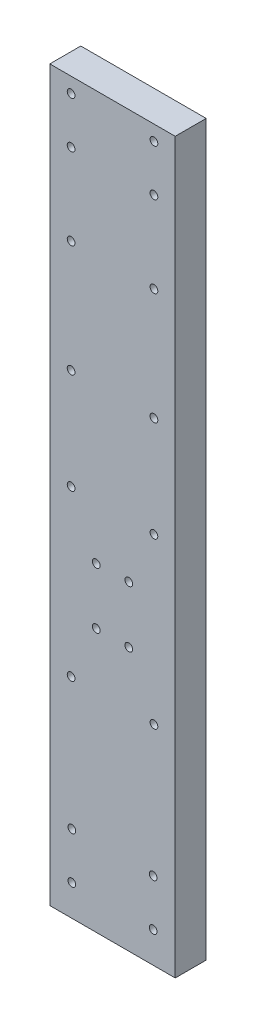
ISO-10303-21;
HEADER;
FILE_DESCRIPTION(('STEP AP214'),'2;1');
FILE_NAME('part.step','',(''),(''),'','','');
FILE_SCHEMA(('AUTOMOTIVE_DESIGN { 1 0 10303 214 1 1 1 1 }'));
ENDSEC;
DATA;
#1=APPLICATION_CONTEXT('core data for automotive mechanical design processes');
#2=APPLICATION_PROTOCOL_DEFINITION('international standard','automotive_design',2000,#1);
#3=PRODUCT_CONTEXT('',#1,'mechanical');
#4=PRODUCT('Part','Part','',(#3));
#5=PRODUCT_RELATED_PRODUCT_CATEGORY('part','',(#4));
#6=PRODUCT_DEFINITION_FORMATION('','',#4);
#7=PRODUCT_DEFINITION_CONTEXT('part definition',#1,'design');
#8=PRODUCT_DEFINITION('design','',#6,#7);
#9=PRODUCT_DEFINITION_SHAPE('','',#8);
#10=(LENGTH_UNIT() NAMED_UNIT(*) SI_UNIT(.MILLI.,.METRE.));
#11=(NAMED_UNIT(*) PLANE_ANGLE_UNIT() SI_UNIT($,.RADIAN.));
#12=(NAMED_UNIT(*) SI_UNIT($,.STERADIAN.) SOLID_ANGLE_UNIT());
#13=UNCERTAINTY_MEASURE_WITH_UNIT(LENGTH_MEASURE(1.E-05),#10,'distance_accuracy_value','');
#14=(GEOMETRIC_REPRESENTATION_CONTEXT(3) GLOBAL_UNCERTAINTY_ASSIGNED_CONTEXT((#13)) GLOBAL_UNIT_ASSIGNED_CONTEXT((#10,
#11,#12)) REPRESENTATION_CONTEXT('',''));
#15=CARTESIAN_POINT('',(0.,0.,0.));
#16=DIRECTION('',(0.,0.,1.));
#17=DIRECTION('',(1.,0.,0.));
#18=AXIS2_PLACEMENT_3D('',#15,#16,#17);
#19=CARTESIAN_POINT('',(0.,0.,4.));
#20=DIRECTION('',(0.,0.,-1.));
#21=DIRECTION('',(-1.,0.,0.));
#22=AXIS2_PLACEMENT_3D('',#19,#20,#21);
#23=PLANE('',#22);
#24=CARTESIAN_POINT('',(2.7500000000009,92.0614488310554,4.));
#25=DIRECTION('',(0.,0.,1.));
#26=DIRECTION('',(-1.,0.,0.));
#27=AXIS2_PLACEMENT_3D('',#24,#25,#26);
#28=CIRCLE('',#27,0.499999999999999);
#29=CARTESIAN_POINT('',(2.2500000000009,92.0614488310554,4.));
#30=VERTEX_POINT('',#29);
#31=EDGE_CURVE('E218',#30,#30,#28,.T.);
#32=ORIENTED_EDGE('',*,*,#31,.F.);
#33=EDGE_LOOP('',(#32));
#34=FACE_BOUND('',#33,.T.);
#35=CARTESIAN_POINT('',(13.4500000000022,86.0614488310554,4.));
#36=DIRECTION('',(0.,0.,1.));
#37=DIRECTION('',(1.,0.,0.));
#38=AXIS2_PLACEMENT_3D('',#35,#36,#37);
#39=CIRCLE('',#38,0.499999999999999);
#40=CARTESIAN_POINT('',(13.9500000000022,86.0614488310554,4.));
#41=VERTEX_POINT('',#40);
#42=EDGE_CURVE('E206',#41,#41,#39,.T.);
#43=ORIENTED_EDGE('',*,*,#42,.F.);
#44=EDGE_LOOP('',(#43));
#45=FACE_BOUND('',#44,.T.);
#46=CARTESIAN_POINT('',(13.4500000000001,75.5614488310554,4.));
#47=DIRECTION('',(0.,0.,1.));
#48=DIRECTION('',(1.,0.,0.));
#49=AXIS2_PLACEMENT_3D('',#46,#47,#48);
#50=CIRCLE('',#49,0.499999999999996);
#51=CARTESIAN_POINT('',(13.9500000000001,75.5614488310554,4.));
#52=VERTEX_POINT('',#51);
#53=EDGE_CURVE('E194',#52,#52,#50,.T.);
#54=ORIENTED_EDGE('',*,*,#53,.F.);
#55=EDGE_LOOP('',(#54));
#56=FACE_BOUND('',#55,.T.);
#57=CARTESIAN_POINT('',(13.350000000001,3.84644883105539,4.));
#58=DIRECTION('',(0.,0.,1.));
#59=DIRECTION('',(-1.,0.,0.));
#60=AXIS2_PLACEMENT_3D('',#57,#58,#59);
#61=CIRCLE('',#60,0.499999999999995);
#62=CARTESIAN_POINT('',(12.850000000001,3.84644883105539,4.));
#63=VERTEX_POINT('',#62);
#64=EDGE_CURVE('E182',#63,#63,#61,.T.);
#65=ORIENTED_EDGE('',*,*,#64,.F.);
#66=EDGE_LOOP('',(#65));
#67=FACE_BOUND('',#66,.T.);
#68=CARTESIAN_POINT('',(2.84999999999999,3.84644883105539,4.));
#69=DIRECTION('',(0.,0.,1.));
#70=DIRECTION('',(1.,0.,0.));
#71=AXIS2_PLACEMENT_3D('',#68,#69,#70);
#72=CIRCLE('',#71,0.499999999999999);
#73=CARTESIAN_POINT('',(3.34999999999999,3.84644883105539,4.));
#74=VERTEX_POINT('',#73);
#75=EDGE_CURVE('E170',#74,#74,#72,.T.);
#76=ORIENTED_EDGE('',*,*,#75,.F.);
#77=EDGE_LOOP('',(#76));
#78=FACE_BOUND('',#77,.T.);
#79=CARTESIAN_POINT('',(2.85,9.84644883105539,4.));
#80=DIRECTION('',(0.,0.,1.));
#81=DIRECTION('',(1.,0.,0.));
#82=AXIS2_PLACEMENT_3D('',#79,#80,#81);
#83=CIRCLE('',#82,0.499999999999999);
#84=CARTESIAN_POINT('',(3.35,9.84644883105539,4.));
#85=VERTEX_POINT('',#84);
#86=EDGE_CURVE('E158',#85,#85,#83,.T.);
#87=ORIENTED_EDGE('',*,*,#86,.F.);
#88=EDGE_LOOP('',(#87));
#89=FACE_BOUND('',#88,.T.);
#90=CARTESIAN_POINT('',(13.4500000000001,48.1064488310554,4.));
#91=DIRECTION('',(0.,0.,1.));
#92=DIRECTION('',(1.,0.,0.));
#93=AXIS2_PLACEMENT_3D('',#90,#91,#92);
#94=CIRCLE('',#93,0.499999999999999);
#95=CARTESIAN_POINT('',(13.9500000000001,48.1064488310554,4.));
#96=VERTEX_POINT('',#95);
#97=EDGE_CURVE('E146',#96,#96,#94,.T.);
#98=ORIENTED_EDGE('',*,*,#97,.F.);
#99=EDGE_LOOP('',(#98));
#100=FACE_BOUND('',#99,.T.);
#101=CARTESIAN_POINT('',(13.4500000000001,26.8464488310553,4.));
#102=DIRECTION('',(0.,0.,1.));
#103=DIRECTION('',(1.,0.,0.));
#104=AXIS2_PLACEMENT_3D('',#101,#102,#103);
#105=CIRCLE('',#104,0.499999999999999);
#106=CARTESIAN_POINT('',(13.9500000000001,26.8464488310553,4.));
#107=VERTEX_POINT('',#106);
#108=EDGE_CURVE('E134',#107,#107,#105,.T.);
#109=ORIENTED_EDGE('',*,*,#108,.F.);
#110=EDGE_LOOP('',(#109));
#111=FACE_BOUND('',#110,.T.);
#112=CARTESIAN_POINT('',(10.2000000000001,33.846448831055,4.));
#113=DIRECTION('',(0.,0.,1.));
#114=DIRECTION('',(1.,0.,0.));
#115=AXIS2_PLACEMENT_3D('',#112,#113,#114);
#116=CIRCLE('',#115,0.499999999999999);
#117=CARTESIAN_POINT('',(10.7000000000001,33.846448831055,4.));
#118=VERTEX_POINT('',#117);
#119=EDGE_CURVE('E122',#118,#118,#116,.T.);
#120=ORIENTED_EDGE('',*,*,#119,.F.);
#121=EDGE_LOOP('',(#120));
#122=FACE_BOUND('',#121,.T.);
#123=CARTESIAN_POINT('',(10.2000000000001,41.1664488310547,4.));
#124=DIRECTION('',(0.,0.,1.));
#125=DIRECTION('',(1.,0.,0.));
#126=AXIS2_PLACEMENT_3D('',#123,#124,#125);
#127=CIRCLE('',#126,0.499999999999999);
#128=CARTESIAN_POINT('',(10.7000000000001,41.1664488310547,4.));
#129=VERTEX_POINT('',#128);
#130=EDGE_CURVE('E101',#129,#129,#127,.T.);
#131=ORIENTED_EDGE('',*,*,#130,.F.);
#132=EDGE_LOOP('',(#131));
#133=FACE_BOUND('',#132,.T.);
#134=DIRECTION('',(1.,0.,0.));
#135=VECTOR('',#134,1.);
#136=CARTESIAN_POINT('',(0.,-0.15355116894461,4.));
#137=LINE('',#136,#135);
#138=CARTESIAN_POINT('',(0.,-0.15355116894461,4.));
#139=VERTEX_POINT('',#138);
#140=CARTESIAN_POINT('',(16.2,-0.15355116894461,4.));
#141=VERTEX_POINT('',#140);
#142=EDGE_CURVE('E86',#139,#141,#137,.T.);
#143=ORIENTED_EDGE('',*,*,#142,.T.);
#144=DIRECTION('',(0.,1.,0.));
#145=VECTOR('',#144,1.);
#146=CARTESIAN_POINT('',(16.2,94.0064488310554,4.));
#147=LINE('',#146,#145);
#148=CARTESIAN_POINT('',(16.2,94.0064488310554,4.));
#149=VERTEX_POINT('',#148);
#150=EDGE_CURVE('E81',#141,#149,#147,.T.);
#151=ORIENTED_EDGE('',*,*,#150,.T.);
#152=DIRECTION('',(-1.,0.,0.));
#153=VECTOR('',#152,1.);
#154=CARTESIAN_POINT('',(0.,94.0064488310554,4.));
#155=LINE('',#154,#153);
#156=CARTESIAN_POINT('',(0.,94.0064488310554,4.));
#157=VERTEX_POINT('',#156);
#158=EDGE_CURVE('E84',#149,#157,#155,.T.);
#159=ORIENTED_EDGE('',*,*,#158,.T.);
#160=DIRECTION('',(0.,-1.,0.));
#161=VECTOR('',#160,1.);
#162=CARTESIAN_POINT('',(0.,94.0064488310554,4.));
#163=LINE('',#162,#161);
#164=EDGE_CURVE('E51',#157,#139,#163,.T.);
#165=ORIENTED_EDGE('',*,*,#164,.T.);
#166=EDGE_LOOP('',(#143,#151,#159,#165));
#167=FACE_BOUND('',#166,.T.);
#168=CARTESIAN_POINT('',(6.,41.1064488310554,4.));
#169=DIRECTION('',(0.,0.,1.));
#170=DIRECTION('',(1.,0.,0.));
#171=AXIS2_PLACEMENT_3D('',#168,#169,#170);
#172=CIRCLE('',#171,0.500000000000001);
#173=CARTESIAN_POINT('',(6.5,41.1064488310554,4.));
#174=VERTEX_POINT('',#173);
#175=EDGE_CURVE('E116',#174,#174,#172,.T.);
#176=ORIENTED_EDGE('',*,*,#175,.F.);
#177=EDGE_LOOP('',(#176));
#178=FACE_BOUND('',#177,.T.);
#179=CARTESIAN_POINT('',(6.,33.846448831055,4.));
#180=DIRECTION('',(0.,0.,1.));
#181=DIRECTION('',(1.,0.,0.));
#182=AXIS2_PLACEMENT_3D('',#179,#180,#181);
#183=CIRCLE('',#182,0.5);
#184=CARTESIAN_POINT('',(6.5,33.846448831055,4.));
#185=VERTEX_POINT('',#184);
#186=EDGE_CURVE('E128',#185,#185,#183,.T.);
#187=ORIENTED_EDGE('',*,*,#186,.F.);
#188=EDGE_LOOP('',(#187));
#189=FACE_BOUND('',#188,.T.);
#190=CARTESIAN_POINT('',(2.75000000000002,26.8464488310555,4.));
#191=DIRECTION('',(0.,0.,1.));
#192=DIRECTION('',(1.,0.,0.));
#193=AXIS2_PLACEMENT_3D('',#190,#191,#192);
#194=CIRCLE('',#193,0.499999999999999);
#195=CARTESIAN_POINT('',(3.25000000000002,26.8464488310555,4.));
#196=VERTEX_POINT('',#195);
#197=EDGE_CURVE('E140',#196,#196,#194,.T.);
#198=ORIENTED_EDGE('',*,*,#197,.F.);
#199=EDGE_LOOP('',(#198));
#200=FACE_BOUND('',#199,.T.);
#201=CARTESIAN_POINT('',(2.75000000000002,48.1064488310554,4.));
#202=DIRECTION('',(0.,0.,1.));
#203=DIRECTION('',(1.,0.,0.));
#204=AXIS2_PLACEMENT_3D('',#201,#202,#203);
#205=CIRCLE('',#204,0.499999999999999);
#206=CARTESIAN_POINT('',(3.25000000000002,48.1064488310554,4.));
#207=VERTEX_POINT('',#206);
#208=EDGE_CURVE('E152',#207,#207,#205,.T.);
#209=ORIENTED_EDGE('',*,*,#208,.F.);
#210=EDGE_LOOP('',(#209));
#211=FACE_BOUND('',#210,.T.);
#212=CARTESIAN_POINT('',(13.4500000000016,61.1064488310554,4.));
#213=DIRECTION('',(0.,0.,1.));
#214=DIRECTION('',(1.,0.,0.));
#215=AXIS2_PLACEMENT_3D('',#212,#213,#214);
#216=CIRCLE('',#215,0.499999999999996);
#217=CARTESIAN_POINT('',(13.9500000000016,61.1064488310554,4.));
#218=VERTEX_POINT('',#217);
#219=EDGE_CURVE('E164',#218,#218,#216,.T.);
#220=ORIENTED_EDGE('',*,*,#219,.F.);
#221=EDGE_LOOP('',(#220));
#222=FACE_BOUND('',#221,.T.);
#223=CARTESIAN_POINT('',(13.350000000001,9.84644883105539,4.));
#224=DIRECTION('',(0.,0.,1.));
#225=DIRECTION('',(-1.,0.,0.));
#226=AXIS2_PLACEMENT_3D('',#223,#224,#225);
#227=CIRCLE('',#226,0.499999999999999);
#228=CARTESIAN_POINT('',(12.850000000001,9.84644883105539,4.));
#229=VERTEX_POINT('',#228);
#230=EDGE_CURVE('E176',#229,#229,#227,.T.);
#231=ORIENTED_EDGE('',*,*,#230,.F.);
#232=EDGE_LOOP('',(#231));
#233=FACE_BOUND('',#232,.T.);
#234=CARTESIAN_POINT('',(2.75000000000136,61.1064488310554,4.));
#235=DIRECTION('',(0.,0.,1.));
#236=DIRECTION('',(1.,0.,0.));
#237=AXIS2_PLACEMENT_3D('',#234,#235,#236);
#238=CIRCLE('',#237,0.499999999999999);
#239=CARTESIAN_POINT('',(3.25000000000136,61.1064488310554,4.));
#240=VERTEX_POINT('',#239);
#241=EDGE_CURVE('E188',#240,#240,#238,.T.);
#242=ORIENTED_EDGE('',*,*,#241,.F.);
#243=EDGE_LOOP('',(#242));
#244=FACE_BOUND('',#243,.T.);
#245=CARTESIAN_POINT('',(2.75000000000002,75.5614488310554,4.));
#246=DIRECTION('',(0.,0.,1.));
#247=DIRECTION('',(1.,0.,0.));
#248=AXIS2_PLACEMENT_3D('',#245,#246,#247);
#249=CIRCLE('',#248,0.499999999999999);
#250=CARTESIAN_POINT('',(3.25000000000002,75.5614488310554,4.));
#251=VERTEX_POINT('',#250);
#252=EDGE_CURVE('E200',#251,#251,#249,.T.);
#253=ORIENTED_EDGE('',*,*,#252,.F.);
#254=EDGE_LOOP('',(#253));
#255=FACE_BOUND('',#254,.T.);
#256=CARTESIAN_POINT('',(2.7500000000009,86.0614488310554,4.));
#257=DIRECTION('',(0.,0.,1.));
#258=DIRECTION('',(1.,0.,0.));
#259=AXIS2_PLACEMENT_3D('',#256,#257,#258);
#260=CIRCLE('',#259,0.499999999999999);
#261=CARTESIAN_POINT('',(3.2500000000009,86.0614488310554,4.));
#262=VERTEX_POINT('',#261);
#263=EDGE_CURVE('E212',#262,#262,#260,.T.);
#264=ORIENTED_EDGE('',*,*,#263,.F.);
#265=EDGE_LOOP('',(#264));
#266=FACE_BOUND('',#265,.T.);
#267=CARTESIAN_POINT('',(13.4500000000022,92.0614488310554,4.));
#268=DIRECTION('',(0.,0.,1.));
#269=DIRECTION('',(-1.,0.,0.));
#270=AXIS2_PLACEMENT_3D('',#267,#268,#269);
#271=CIRCLE('',#270,0.499999999999996);
#272=CARTESIAN_POINT('',(12.9500000000022,92.0614488310554,4.));
#273=VERTEX_POINT('',#272);
#274=EDGE_CURVE('E224',#273,#273,#271,.T.);
#275=ORIENTED_EDGE('',*,*,#274,.F.);
#276=EDGE_LOOP('',(#275));
#277=FACE_BOUND('',#276,.T.);
#278=ADVANCED_FACE('F34',(#34,#45,#56,#67,#78,#89,#100,#111,#122,#133,#167,#178,#189,#200,#211,
#222,#233,#244,#255,#266,#277),#23,.F.);
#279=CARTESIAN_POINT('',(0.,0.,0.));
#280=DIRECTION('',(0.,0.,-1.));
#281=DIRECTION('',(-1.,0.,0.));
#282=AXIS2_PLACEMENT_3D('',#279,#280,#281);
#283=PLANE('',#282);
#284=CARTESIAN_POINT('',(2.7500000000009,92.0614488310554,0.));
#285=DIRECTION('',(0.,0.,1.));
#286=DIRECTION('',(-1.,0.,0.));
#287=AXIS2_PLACEMENT_3D('',#284,#285,#286);
#288=CIRCLE('',#287,0.499999999999999);
#289=CARTESIAN_POINT('',(2.2500000000009,92.0614488310554,0.));
#290=VERTEX_POINT('',#289);
#291=EDGE_CURVE('E221',#290,#290,#288,.T.);
#292=ORIENTED_EDGE('',*,*,#291,.T.);
#293=EDGE_LOOP('',(#292));
#294=FACE_BOUND('',#293,.T.);
#295=CARTESIAN_POINT('',(13.4500000000022,86.0614488310554,0.));
#296=DIRECTION('',(0.,0.,1.));
#297=DIRECTION('',(1.,0.,0.));
#298=AXIS2_PLACEMENT_3D('',#295,#296,#297);
#299=CIRCLE('',#298,0.499999999999999);
#300=CARTESIAN_POINT('',(13.9500000000022,86.0614488310554,0.));
#301=VERTEX_POINT('',#300);
#302=EDGE_CURVE('E209',#301,#301,#299,.T.);
#303=ORIENTED_EDGE('',*,*,#302,.T.);
#304=EDGE_LOOP('',(#303));
#305=FACE_BOUND('',#304,.T.);
#306=CARTESIAN_POINT('',(13.4500000000001,75.5614488310554,0.));
#307=DIRECTION('',(0.,0.,1.));
#308=DIRECTION('',(1.,0.,0.));
#309=AXIS2_PLACEMENT_3D('',#306,#307,#308);
#310=CIRCLE('',#309,0.499999999999996);
#311=CARTESIAN_POINT('',(13.9500000000001,75.5614488310554,0.));
#312=VERTEX_POINT('',#311);
#313=EDGE_CURVE('E197',#312,#312,#310,.T.);
#314=ORIENTED_EDGE('',*,*,#313,.T.);
#315=EDGE_LOOP('',(#314));
#316=FACE_BOUND('',#315,.T.);
#317=CARTESIAN_POINT('',(13.350000000001,3.84644883105539,0.));
#318=DIRECTION('',(0.,0.,1.));
#319=DIRECTION('',(-1.,0.,0.));
#320=AXIS2_PLACEMENT_3D('',#317,#318,#319);
#321=CIRCLE('',#320,0.499999999999995);
#322=CARTESIAN_POINT('',(12.850000000001,3.84644883105539,0.));
#323=VERTEX_POINT('',#322);
#324=EDGE_CURVE('E185',#323,#323,#321,.T.);
#325=ORIENTED_EDGE('',*,*,#324,.T.);
#326=EDGE_LOOP('',(#325));
#327=FACE_BOUND('',#326,.T.);
#328=CARTESIAN_POINT('',(2.84999999999999,3.84644883105539,0.));
#329=DIRECTION('',(0.,0.,1.));
#330=DIRECTION('',(1.,0.,0.));
#331=AXIS2_PLACEMENT_3D('',#328,#329,#330);
#332=CIRCLE('',#331,0.499999999999999);
#333=CARTESIAN_POINT('',(3.34999999999999,3.84644883105539,0.));
#334=VERTEX_POINT('',#333);
#335=EDGE_CURVE('E173',#334,#334,#332,.T.);
#336=ORIENTED_EDGE('',*,*,#335,.T.);
#337=EDGE_LOOP('',(#336));
#338=FACE_BOUND('',#337,.T.);
#339=CARTESIAN_POINT('',(2.85,9.84644883105539,0.));
#340=DIRECTION('',(0.,0.,1.));
#341=DIRECTION('',(1.,0.,0.));
#342=AXIS2_PLACEMENT_3D('',#339,#340,#341);
#343=CIRCLE('',#342,0.499999999999999);
#344=CARTESIAN_POINT('',(3.35,9.84644883105539,0.));
#345=VERTEX_POINT('',#344);
#346=EDGE_CURVE('E161',#345,#345,#343,.T.);
#347=ORIENTED_EDGE('',*,*,#346,.T.);
#348=EDGE_LOOP('',(#347));
#349=FACE_BOUND('',#348,.T.);
#350=CARTESIAN_POINT('',(13.4500000000001,48.1064488310554,0.));
#351=DIRECTION('',(0.,0.,1.));
#352=DIRECTION('',(1.,0.,0.));
#353=AXIS2_PLACEMENT_3D('',#350,#351,#352);
#354=CIRCLE('',#353,0.499999999999999);
#355=CARTESIAN_POINT('',(13.9500000000001,48.1064488310554,0.));
#356=VERTEX_POINT('',#355);
#357=EDGE_CURVE('E149',#356,#356,#354,.T.);
#358=ORIENTED_EDGE('',*,*,#357,.T.);
#359=EDGE_LOOP('',(#358));
#360=FACE_BOUND('',#359,.T.);
#361=CARTESIAN_POINT('',(13.4500000000001,26.8464488310553,0.));
#362=DIRECTION('',(0.,0.,1.));
#363=DIRECTION('',(1.,0.,0.));
#364=AXIS2_PLACEMENT_3D('',#361,#362,#363);
#365=CIRCLE('',#364,0.499999999999999);
#366=CARTESIAN_POINT('',(13.9500000000001,26.8464488310553,0.));
#367=VERTEX_POINT('',#366);
#368=EDGE_CURVE('E137',#367,#367,#365,.T.);
#369=ORIENTED_EDGE('',*,*,#368,.T.);
#370=EDGE_LOOP('',(#369));
#371=FACE_BOUND('',#370,.T.);
#372=CARTESIAN_POINT('',(10.2000000000001,33.846448831055,0.));
#373=DIRECTION('',(0.,0.,1.));
#374=DIRECTION('',(1.,0.,0.));
#375=AXIS2_PLACEMENT_3D('',#372,#373,#374);
#376=CIRCLE('',#375,0.499999999999999);
#377=CARTESIAN_POINT('',(10.7000000000001,33.846448831055,0.));
#378=VERTEX_POINT('',#377);
#379=EDGE_CURVE('E125',#378,#378,#376,.T.);
#380=ORIENTED_EDGE('',*,*,#379,.T.);
#381=EDGE_LOOP('',(#380));
#382=FACE_BOUND('',#381,.T.);
#383=CARTESIAN_POINT('',(10.2000000000001,41.1664488310547,0.));
#384=DIRECTION('',(0.,0.,1.));
#385=DIRECTION('',(1.,0.,0.));
#386=AXIS2_PLACEMENT_3D('',#383,#384,#385);
#387=CIRCLE('',#386,0.499999999999999);
#388=CARTESIAN_POINT('',(10.7000000000001,41.1664488310547,0.));
#389=VERTEX_POINT('',#388);
#390=EDGE_CURVE('E113',#389,#389,#387,.T.);
#391=ORIENTED_EDGE('',*,*,#390,.T.);
#392=EDGE_LOOP('',(#391));
#393=FACE_BOUND('',#392,.T.);
#394=DIRECTION('',(1.,0.,0.));
#395=VECTOR('',#394,1.);
#396=CARTESIAN_POINT('',(0.,-0.15355116894461,0.));
#397=LINE('',#396,#395);
#398=CARTESIAN_POINT('',(0.,-0.15355116894461,0.));
#399=VERTEX_POINT('',#398);
#400=CARTESIAN_POINT('',(16.2,-0.15355116894461,0.));
#401=VERTEX_POINT('',#400);
#402=EDGE_CURVE('E98',#399,#401,#397,.T.);
#403=ORIENTED_EDGE('',*,*,#402,.F.);
#404=DIRECTION('',(0.,-1.,0.));
#405=VECTOR('',#404,1.);
#406=CARTESIAN_POINT('',(0.,94.0064488310554,0.));
#407=LINE('',#406,#405);
#408=CARTESIAN_POINT('',(0.,94.0064488310554,0.));
#409=VERTEX_POINT('',#408);
#410=EDGE_CURVE('E74',#409,#399,#407,.T.);
#411=ORIENTED_EDGE('',*,*,#410,.F.);
#412=DIRECTION('',(-1.,0.,0.));
#413=VECTOR('',#412,1.);
#414=CARTESIAN_POINT('',(0.,94.0064488310554,0.));
#415=LINE('',#414,#413);
#416=CARTESIAN_POINT('',(16.2,94.0064488310554,0.));
#417=VERTEX_POINT('',#416);
#418=EDGE_CURVE('E68',#417,#409,#415,.T.);
#419=ORIENTED_EDGE('',*,*,#418,.F.);
#420=DIRECTION('',(0.,1.,0.));
#421=VECTOR('',#420,1.);
#422=CARTESIAN_POINT('',(16.2,94.0064488310554,0.));
#423=LINE('',#422,#421);
#424=EDGE_CURVE('E90',#401,#417,#423,.T.);
#425=ORIENTED_EDGE('',*,*,#424,.F.);
#426=EDGE_LOOP('',(#403,#411,#419,#425));
#427=FACE_BOUND('',#426,.T.);
#428=CARTESIAN_POINT('',(6.,41.1064488310554,0.));
#429=DIRECTION('',(0.,0.,1.));
#430=DIRECTION('',(1.,0.,0.));
#431=AXIS2_PLACEMENT_3D('',#428,#429,#430);
#432=CIRCLE('',#431,0.500000000000001);
#433=CARTESIAN_POINT('',(6.5,41.1064488310554,0.));
#434=VERTEX_POINT('',#433);
#435=EDGE_CURVE('E119',#434,#434,#432,.T.);
#436=ORIENTED_EDGE('',*,*,#435,.T.);
#437=EDGE_LOOP('',(#436));
#438=FACE_BOUND('',#437,.T.);
#439=CARTESIAN_POINT('',(6.,33.846448831055,0.));
#440=DIRECTION('',(0.,0.,1.));
#441=DIRECTION('',(1.,0.,0.));
#442=AXIS2_PLACEMENT_3D('',#439,#440,#441);
#443=CIRCLE('',#442,0.5);
#444=CARTESIAN_POINT('',(6.5,33.846448831055,0.));
#445=VERTEX_POINT('',#444);
#446=EDGE_CURVE('E131',#445,#445,#443,.T.);
#447=ORIENTED_EDGE('',*,*,#446,.T.);
#448=EDGE_LOOP('',(#447));
#449=FACE_BOUND('',#448,.T.);
#450=CARTESIAN_POINT('',(2.75000000000002,26.8464488310555,0.));
#451=DIRECTION('',(0.,0.,1.));
#452=DIRECTION('',(1.,0.,0.));
#453=AXIS2_PLACEMENT_3D('',#450,#451,#452);
#454=CIRCLE('',#453,0.499999999999999);
#455=CARTESIAN_POINT('',(3.25000000000002,26.8464488310555,0.));
#456=VERTEX_POINT('',#455);
#457=EDGE_CURVE('E143',#456,#456,#454,.T.);
#458=ORIENTED_EDGE('',*,*,#457,.T.);
#459=EDGE_LOOP('',(#458));
#460=FACE_BOUND('',#459,.T.);
#461=CARTESIAN_POINT('',(2.75000000000002,48.1064488310554,0.));
#462=DIRECTION('',(0.,0.,1.));
#463=DIRECTION('',(1.,0.,0.));
#464=AXIS2_PLACEMENT_3D('',#461,#462,#463);
#465=CIRCLE('',#464,0.499999999999999);
#466=CARTESIAN_POINT('',(3.25000000000002,48.1064488310554,0.));
#467=VERTEX_POINT('',#466);
#468=EDGE_CURVE('E155',#467,#467,#465,.T.);
#469=ORIENTED_EDGE('',*,*,#468,.T.);
#470=EDGE_LOOP('',(#469));
#471=FACE_BOUND('',#470,.T.);
#472=CARTESIAN_POINT('',(13.4500000000016,61.1064488310554,0.));
#473=DIRECTION('',(0.,0.,1.));
#474=DIRECTION('',(1.,0.,0.));
#475=AXIS2_PLACEMENT_3D('',#472,#473,#474);
#476=CIRCLE('',#475,0.499999999999996);
#477=CARTESIAN_POINT('',(13.9500000000016,61.1064488310554,0.));
#478=VERTEX_POINT('',#477);
#479=EDGE_CURVE('E167',#478,#478,#476,.T.);
#480=ORIENTED_EDGE('',*,*,#479,.T.);
#481=EDGE_LOOP('',(#480));
#482=FACE_BOUND('',#481,.T.);
#483=CARTESIAN_POINT('',(13.350000000001,9.84644883105539,0.));
#484=DIRECTION('',(0.,0.,1.));
#485=DIRECTION('',(-1.,0.,0.));
#486=AXIS2_PLACEMENT_3D('',#483,#484,#485);
#487=CIRCLE('',#486,0.499999999999999);
#488=CARTESIAN_POINT('',(12.850000000001,9.84644883105539,0.));
#489=VERTEX_POINT('',#488);
#490=EDGE_CURVE('E179',#489,#489,#487,.T.);
#491=ORIENTED_EDGE('',*,*,#490,.T.);
#492=EDGE_LOOP('',(#491));
#493=FACE_BOUND('',#492,.T.);
#494=CARTESIAN_POINT('',(2.75000000000136,61.1064488310554,0.));
#495=DIRECTION('',(0.,0.,1.));
#496=DIRECTION('',(1.,0.,0.));
#497=AXIS2_PLACEMENT_3D('',#494,#495,#496);
#498=CIRCLE('',#497,0.499999999999999);
#499=CARTESIAN_POINT('',(3.25000000000136,61.1064488310554,0.));
#500=VERTEX_POINT('',#499);
#501=EDGE_CURVE('E191',#500,#500,#498,.T.);
#502=ORIENTED_EDGE('',*,*,#501,.T.);
#503=EDGE_LOOP('',(#502));
#504=FACE_BOUND('',#503,.T.);
#505=CARTESIAN_POINT('',(2.75000000000002,75.5614488310554,0.));
#506=DIRECTION('',(0.,0.,1.));
#507=DIRECTION('',(1.,0.,0.));
#508=AXIS2_PLACEMENT_3D('',#505,#506,#507);
#509=CIRCLE('',#508,0.499999999999999);
#510=CARTESIAN_POINT('',(3.25000000000002,75.5614488310554,0.));
#511=VERTEX_POINT('',#510);
#512=EDGE_CURVE('E203',#511,#511,#509,.T.);
#513=ORIENTED_EDGE('',*,*,#512,.T.);
#514=EDGE_LOOP('',(#513));
#515=FACE_BOUND('',#514,.T.);
#516=CARTESIAN_POINT('',(2.7500000000009,86.0614488310554,0.));
#517=DIRECTION('',(0.,0.,1.));
#518=DIRECTION('',(1.,0.,0.));
#519=AXIS2_PLACEMENT_3D('',#516,#517,#518);
#520=CIRCLE('',#519,0.499999999999999);
#521=CARTESIAN_POINT('',(3.2500000000009,86.0614488310554,0.));
#522=VERTEX_POINT('',#521);
#523=EDGE_CURVE('E215',#522,#522,#520,.T.);
#524=ORIENTED_EDGE('',*,*,#523,.T.);
#525=EDGE_LOOP('',(#524));
#526=FACE_BOUND('',#525,.T.);
#527=CARTESIAN_POINT('',(13.4500000000022,92.0614488310554,0.));
#528=DIRECTION('',(0.,0.,1.));
#529=DIRECTION('',(-1.,0.,0.));
#530=AXIS2_PLACEMENT_3D('',#527,#528,#529);
#531=CIRCLE('',#530,0.499999999999996);
#532=CARTESIAN_POINT('',(12.9500000000022,92.0614488310554,0.));
#533=VERTEX_POINT('',#532);
#534=EDGE_CURVE('E227',#533,#533,#531,.T.);
#535=ORIENTED_EDGE('',*,*,#534,.T.);
#536=EDGE_LOOP('',(#535));
#537=FACE_BOUND('',#536,.T.);
#538=ADVANCED_FACE('F109',(#294,#305,#316,#327,#338,#349,#360,#371,#382,#393,#427,#438,#449,
#460,#471,#482,#493,#504,#515,#526,#537),#283,.T.);
#539=CARTESIAN_POINT('',(0.,-0.15355116894461,4.));
#540=DIRECTION('',(0.,1.,0.));
#541=DIRECTION('',(0.,0.,1.));
#542=AXIS2_PLACEMENT_3D('',#539,#540,#541);
#543=PLANE('',#542);
#544=ORIENTED_EDGE('',*,*,#402,.T.);
#545=DIRECTION('',(0.,0.,-1.));
#546=VECTOR('',#545,1.);
#547=CARTESIAN_POINT('',(16.2,-0.15355116894461,4.));
#548=LINE('',#547,#546);
#549=EDGE_CURVE('E11',#141,#401,#548,.T.);
#550=ORIENTED_EDGE('',*,*,#549,.F.);
#551=ORIENTED_EDGE('',*,*,#142,.F.);
#552=DIRECTION('',(0.,0.,-1.));
#553=VECTOR('',#552,1.);
#554=CARTESIAN_POINT('',(0.,-0.15355116894461,4.));
#555=LINE('',#554,#553);
#556=EDGE_CURVE('E94',#139,#399,#555,.T.);
#557=ORIENTED_EDGE('',*,*,#556,.T.);
#558=EDGE_LOOP('',(#544,#550,#551,#557));
#559=FACE_BOUND('',#558,.T.);
#560=ADVANCED_FACE('F36',(#559),#543,.F.);
#561=CARTESIAN_POINT('',(16.2,94.0064488310554,4.));
#562=DIRECTION('',(-1.,0.,0.));
#563=DIRECTION('',(0.,-1.,0.));
#564=AXIS2_PLACEMENT_3D('',#561,#562,#563);
#565=PLANE('',#564);
#566=ORIENTED_EDGE('',*,*,#424,.T.);
#567=DIRECTION('',(0.,0.,-1.));
#568=VECTOR('',#567,1.);
#569=CARTESIAN_POINT('',(16.2,94.0064488310554,4.));
#570=LINE('',#569,#568);
#571=EDGE_CURVE('E43',#149,#417,#570,.T.);
#572=ORIENTED_EDGE('',*,*,#571,.F.);
#573=ORIENTED_EDGE('',*,*,#150,.F.);
#574=ORIENTED_EDGE('',*,*,#549,.T.);
#575=EDGE_LOOP('',(#566,#572,#573,#574));
#576=FACE_BOUND('',#575,.T.);
#577=ADVANCED_FACE('F89',(#576),#565,.F.);
#578=CARTESIAN_POINT('',(0.,94.0064488310554,4.));
#579=DIRECTION('',(0.,-1.,0.));
#580=DIRECTION('',(0.,0.,-1.));
#581=AXIS2_PLACEMENT_3D('',#578,#579,#580);
#582=PLANE('',#581);
#583=ORIENTED_EDGE('',*,*,#418,.T.);
#584=DIRECTION('',(0.,0.,-1.));
#585=VECTOR('',#584,1.);
#586=CARTESIAN_POINT('',(0.,94.0064488310554,4.));
#587=LINE('',#586,#585);
#588=EDGE_CURVE('E91',#157,#409,#587,.T.);
#589=ORIENTED_EDGE('',*,*,#588,.F.);
#590=ORIENTED_EDGE('',*,*,#158,.F.);
#591=ORIENTED_EDGE('',*,*,#571,.T.);
#592=EDGE_LOOP('',(#583,#589,#590,#591));
#593=FACE_BOUND('',#592,.T.);
#594=ADVANCED_FACE('F92',(#593),#582,.F.);
#595=CARTESIAN_POINT('',(0.,94.0064488310554,4.));
#596=DIRECTION('',(1.,0.,0.));
#597=DIRECTION('',(0.,1.,0.));
#598=AXIS2_PLACEMENT_3D('',#595,#596,#597);
#599=PLANE('',#598);
#600=ORIENTED_EDGE('',*,*,#410,.T.);
#601=ORIENTED_EDGE('',*,*,#556,.F.);
#602=ORIENTED_EDGE('',*,*,#164,.F.);
#603=ORIENTED_EDGE('',*,*,#588,.T.);
#604=EDGE_LOOP('',(#600,#601,#602,#603));
#605=FACE_BOUND('',#604,.T.);
#606=ADVANCED_FACE('F106',(#605),#599,.F.);
#607=CARTESIAN_POINT('',(10.2000000000001,41.1664488310547,4.));
#608=DIRECTION('',(0.,0.,-1.));
#609=DIRECTION('',(-1.,0.,0.));
#610=AXIS2_PLACEMENT_3D('',#607,#608,#609);
#611=CYLINDRICAL_SURFACE('',#610,0.499999999999999);
#612=ORIENTED_EDGE('',*,*,#130,.T.);
#613=EDGE_LOOP('',(#612));
#614=FACE_BOUND('',#613,.T.);
#615=ORIENTED_EDGE('',*,*,#390,.F.);
#616=EDGE_LOOP('',(#615));
#617=FACE_BOUND('',#616,.T.);
#618=ADVANCED_FACE('F247',(#614,#617),#611,.F.);
#619=CARTESIAN_POINT('',(6.,41.1064488310554,4.));
#620=DIRECTION('',(0.,0.,-1.));
#621=DIRECTION('',(-1.,0.,0.));
#622=AXIS2_PLACEMENT_3D('',#619,#620,#621);
#623=CYLINDRICAL_SURFACE('',#622,0.500000000000001);
#624=ORIENTED_EDGE('',*,*,#175,.T.);
#625=EDGE_LOOP('',(#624));
#626=FACE_BOUND('',#625,.T.);
#627=ORIENTED_EDGE('',*,*,#435,.F.);
#628=EDGE_LOOP('',(#627));
#629=FACE_BOUND('',#628,.T.);
#630=ADVANCED_FACE('F293',(#626,#629),#623,.F.);
#631=CARTESIAN_POINT('',(10.2000000000001,33.846448831055,4.));
#632=DIRECTION('',(0.,0.,-1.));
#633=DIRECTION('',(-1.,0.,0.));
#634=AXIS2_PLACEMENT_3D('',#631,#632,#633);
#635=CYLINDRICAL_SURFACE('',#634,0.499999999999999);
#636=ORIENTED_EDGE('',*,*,#119,.T.);
#637=EDGE_LOOP('',(#636));
#638=FACE_BOUND('',#637,.T.);
#639=ORIENTED_EDGE('',*,*,#379,.F.);
#640=EDGE_LOOP('',(#639));
#641=FACE_BOUND('',#640,.T.);
#642=ADVANCED_FACE('F301',(#638,#641),#635,.F.);
#643=CARTESIAN_POINT('',(6.,33.846448831055,4.));
#644=DIRECTION('',(0.,0.,-1.));
#645=DIRECTION('',(-1.,0.,0.));
#646=AXIS2_PLACEMENT_3D('',#643,#644,#645);
#647=CYLINDRICAL_SURFACE('',#646,0.5);
#648=ORIENTED_EDGE('',*,*,#186,.T.);
#649=EDGE_LOOP('',(#648));
#650=FACE_BOUND('',#649,.T.);
#651=ORIENTED_EDGE('',*,*,#446,.F.);
#652=EDGE_LOOP('',(#651));
#653=FACE_BOUND('',#652,.T.);
#654=ADVANCED_FACE('F309',(#650,#653),#647,.F.);
#655=CARTESIAN_POINT('',(13.4500000000001,26.8464488310553,4.));
#656=DIRECTION('',(0.,0.,-1.));
#657=DIRECTION('',(-1.,0.,0.));
#658=AXIS2_PLACEMENT_3D('',#655,#656,#657);
#659=CYLINDRICAL_SURFACE('',#658,0.499999999999999);
#660=ORIENTED_EDGE('',*,*,#108,.T.);
#661=EDGE_LOOP('',(#660));
#662=FACE_BOUND('',#661,.T.);
#663=ORIENTED_EDGE('',*,*,#368,.F.);
#664=EDGE_LOOP('',(#663));
#665=FACE_BOUND('',#664,.T.);
#666=ADVANCED_FACE('F318',(#662,#665),#659,.F.);
#667=CARTESIAN_POINT('',(2.75000000000002,26.8464488310555,4.));
#668=DIRECTION('',(0.,0.,-1.));
#669=DIRECTION('',(-1.,0.,0.));
#670=AXIS2_PLACEMENT_3D('',#667,#668,#669);
#671=CYLINDRICAL_SURFACE('',#670,0.499999999999999);
#672=ORIENTED_EDGE('',*,*,#197,.T.);
#673=EDGE_LOOP('',(#672));
#674=FACE_BOUND('',#673,.T.);
#675=ORIENTED_EDGE('',*,*,#457,.F.);
#676=EDGE_LOOP('',(#675));
#677=FACE_BOUND('',#676,.T.);
#678=ADVANCED_FACE('F327',(#674,#677),#671,.F.);
#679=CARTESIAN_POINT('',(13.4500000000001,48.1064488310554,4.));
#680=DIRECTION('',(0.,0.,-1.));
#681=DIRECTION('',(-1.,0.,0.));
#682=AXIS2_PLACEMENT_3D('',#679,#680,#681);
#683=CYLINDRICAL_SURFACE('',#682,0.499999999999999);
#684=ORIENTED_EDGE('',*,*,#97,.T.);
#685=EDGE_LOOP('',(#684));
#686=FACE_BOUND('',#685,.T.);
#687=ORIENTED_EDGE('',*,*,#357,.F.);
#688=EDGE_LOOP('',(#687));
#689=FACE_BOUND('',#688,.T.);
#690=ADVANCED_FACE('F336',(#686,#689),#683,.F.);
#691=CARTESIAN_POINT('',(2.75000000000002,48.1064488310554,4.));
#692=DIRECTION('',(0.,0.,-1.));
#693=DIRECTION('',(-1.,0.,0.));
#694=AXIS2_PLACEMENT_3D('',#691,#692,#693);
#695=CYLINDRICAL_SURFACE('',#694,0.499999999999999);
#696=ORIENTED_EDGE('',*,*,#208,.T.);
#697=EDGE_LOOP('',(#696));
#698=FACE_BOUND('',#697,.T.);
#699=ORIENTED_EDGE('',*,*,#468,.F.);
#700=EDGE_LOOP('',(#699));
#701=FACE_BOUND('',#700,.T.);
#702=ADVANCED_FACE('F345',(#698,#701),#695,.F.);
#703=CARTESIAN_POINT('',(2.85,9.84644883105539,4.));
#704=DIRECTION('',(0.,0.,-1.));
#705=DIRECTION('',(-1.,0.,0.));
#706=AXIS2_PLACEMENT_3D('',#703,#704,#705);
#707=CYLINDRICAL_SURFACE('',#706,0.499999999999999);
#708=ORIENTED_EDGE('',*,*,#86,.T.);
#709=EDGE_LOOP('',(#708));
#710=FACE_BOUND('',#709,.T.);
#711=ORIENTED_EDGE('',*,*,#346,.F.);
#712=EDGE_LOOP('',(#711));
#713=FACE_BOUND('',#712,.T.);
#714=ADVANCED_FACE('F354',(#710,#713),#707,.F.);
#715=CARTESIAN_POINT('',(13.4500000000016,61.1064488310554,4.));
#716=DIRECTION('',(0.,0.,-1.));
#717=DIRECTION('',(-1.,0.,0.));
#718=AXIS2_PLACEMENT_3D('',#715,#716,#717);
#719=CYLINDRICAL_SURFACE('',#718,0.499999999999996);
#720=ORIENTED_EDGE('',*,*,#219,.T.);
#721=EDGE_LOOP('',(#720));
#722=FACE_BOUND('',#721,.T.);
#723=ORIENTED_EDGE('',*,*,#479,.F.);
#724=EDGE_LOOP('',(#723));
#725=FACE_BOUND('',#724,.T.);
#726=ADVANCED_FACE('F363',(#722,#725),#719,.F.);
#727=CARTESIAN_POINT('',(2.84999999999999,3.84644883105539,4.));
#728=DIRECTION('',(0.,0.,-1.));
#729=DIRECTION('',(-1.,0.,0.));
#730=AXIS2_PLACEMENT_3D('',#727,#728,#729);
#731=CYLINDRICAL_SURFACE('',#730,0.499999999999999);
#732=ORIENTED_EDGE('',*,*,#75,.T.);
#733=EDGE_LOOP('',(#732));
#734=FACE_BOUND('',#733,.T.);
#735=ORIENTED_EDGE('',*,*,#335,.F.);
#736=EDGE_LOOP('',(#735));
#737=FACE_BOUND('',#736,.T.);
#738=ADVANCED_FACE('F372',(#734,#737),#731,.F.);
#739=CARTESIAN_POINT('',(13.350000000001,9.84644883105539,4.));
#740=DIRECTION('',(0.,0.,-1.));
#741=DIRECTION('',(-1.,0.,0.));
#742=AXIS2_PLACEMENT_3D('',#739,#740,#741);
#743=CYLINDRICAL_SURFACE('',#742,0.499999999999999);
#744=ORIENTED_EDGE('',*,*,#230,.T.);
#745=EDGE_LOOP('',(#744));
#746=FACE_BOUND('',#745,.T.);
#747=ORIENTED_EDGE('',*,*,#490,.F.);
#748=EDGE_LOOP('',(#747));
#749=FACE_BOUND('',#748,.T.);
#750=ADVANCED_FACE('F381',(#746,#749),#743,.F.);
#751=CARTESIAN_POINT('',(13.350000000001,3.84644883105539,4.));
#752=DIRECTION('',(0.,0.,-1.));
#753=DIRECTION('',(-1.,0.,0.));
#754=AXIS2_PLACEMENT_3D('',#751,#752,#753);
#755=CYLINDRICAL_SURFACE('',#754,0.499999999999995);
#756=ORIENTED_EDGE('',*,*,#64,.T.);
#757=EDGE_LOOP('',(#756));
#758=FACE_BOUND('',#757,.T.);
#759=ORIENTED_EDGE('',*,*,#324,.F.);
#760=EDGE_LOOP('',(#759));
#761=FACE_BOUND('',#760,.T.);
#762=ADVANCED_FACE('F390',(#758,#761),#755,.F.);
#763=CARTESIAN_POINT('',(2.75000000000136,61.1064488310554,4.));
#764=DIRECTION('',(0.,0.,-1.));
#765=DIRECTION('',(-1.,0.,0.));
#766=AXIS2_PLACEMENT_3D('',#763,#764,#765);
#767=CYLINDRICAL_SURFACE('',#766,0.499999999999999);
#768=ORIENTED_EDGE('',*,*,#241,.T.);
#769=EDGE_LOOP('',(#768));
#770=FACE_BOUND('',#769,.T.);
#771=ORIENTED_EDGE('',*,*,#501,.F.);
#772=EDGE_LOOP('',(#771));
#773=FACE_BOUND('',#772,.T.);
#774=ADVANCED_FACE('F399',(#770,#773),#767,.F.);
#775=CARTESIAN_POINT('',(13.4500000000001,75.5614488310554,4.));
#776=DIRECTION('',(0.,0.,-1.));
#777=DIRECTION('',(-1.,0.,0.));
#778=AXIS2_PLACEMENT_3D('',#775,#776,#777);
#779=CYLINDRICAL_SURFACE('',#778,0.499999999999996);
#780=ORIENTED_EDGE('',*,*,#53,.T.);
#781=EDGE_LOOP('',(#780));
#782=FACE_BOUND('',#781,.T.);
#783=ORIENTED_EDGE('',*,*,#313,.F.);
#784=EDGE_LOOP('',(#783));
#785=FACE_BOUND('',#784,.T.);
#786=ADVANCED_FACE('F408',(#782,#785),#779,.F.);
#787=CARTESIAN_POINT('',(2.75000000000002,75.5614488310554,4.));
#788=DIRECTION('',(0.,0.,-1.));
#789=DIRECTION('',(-1.,0.,0.));
#790=AXIS2_PLACEMENT_3D('',#787,#788,#789);
#791=CYLINDRICAL_SURFACE('',#790,0.499999999999999);
#792=ORIENTED_EDGE('',*,*,#252,.T.);
#793=EDGE_LOOP('',(#792));
#794=FACE_BOUND('',#793,.T.);
#795=ORIENTED_EDGE('',*,*,#512,.F.);
#796=EDGE_LOOP('',(#795));
#797=FACE_BOUND('',#796,.T.);
#798=ADVANCED_FACE('F417',(#794,#797),#791,.F.);
#799=CARTESIAN_POINT('',(13.4500000000022,86.0614488310554,4.));
#800=DIRECTION('',(0.,0.,-1.));
#801=DIRECTION('',(-1.,0.,0.));
#802=AXIS2_PLACEMENT_3D('',#799,#800,#801);
#803=CYLINDRICAL_SURFACE('',#802,0.499999999999999);
#804=ORIENTED_EDGE('',*,*,#42,.T.);
#805=EDGE_LOOP('',(#804));
#806=FACE_BOUND('',#805,.T.);
#807=ORIENTED_EDGE('',*,*,#302,.F.);
#808=EDGE_LOOP('',(#807));
#809=FACE_BOUND('',#808,.T.);
#810=ADVANCED_FACE('F426',(#806,#809),#803,.F.);
#811=CARTESIAN_POINT('',(2.7500000000009,86.0614488310554,4.));
#812=DIRECTION('',(0.,0.,-1.));
#813=DIRECTION('',(-1.,0.,0.));
#814=AXIS2_PLACEMENT_3D('',#811,#812,#813);
#815=CYLINDRICAL_SURFACE('',#814,0.499999999999999);
#816=ORIENTED_EDGE('',*,*,#263,.T.);
#817=EDGE_LOOP('',(#816));
#818=FACE_BOUND('',#817,.T.);
#819=ORIENTED_EDGE('',*,*,#523,.F.);
#820=EDGE_LOOP('',(#819));
#821=FACE_BOUND('',#820,.T.);
#822=ADVANCED_FACE('F435',(#818,#821),#815,.F.);
#823=CARTESIAN_POINT('',(2.7500000000009,92.0614488310554,4.));
#824=DIRECTION('',(0.,0.,-1.));
#825=DIRECTION('',(-1.,0.,0.));
#826=AXIS2_PLACEMENT_3D('',#823,#824,#825);
#827=CYLINDRICAL_SURFACE('',#826,0.499999999999999);
#828=ORIENTED_EDGE('',*,*,#31,.T.);
#829=EDGE_LOOP('',(#828));
#830=FACE_BOUND('',#829,.T.);
#831=ORIENTED_EDGE('',*,*,#291,.F.);
#832=EDGE_LOOP('',(#831));
#833=FACE_BOUND('',#832,.T.);
#834=ADVANCED_FACE('F444',(#830,#833),#827,.F.);
#835=CARTESIAN_POINT('',(13.4500000000022,92.0614488310554,4.));
#836=DIRECTION('',(0.,0.,-1.));
#837=DIRECTION('',(-1.,0.,0.));
#838=AXIS2_PLACEMENT_3D('',#835,#836,#837);
#839=CYLINDRICAL_SURFACE('',#838,0.499999999999996);
#840=ORIENTED_EDGE('',*,*,#274,.T.);
#841=EDGE_LOOP('',(#840));
#842=FACE_BOUND('',#841,.T.);
#843=ORIENTED_EDGE('',*,*,#534,.F.);
#844=EDGE_LOOP('',(#843));
#845=FACE_BOUND('',#844,.T.);
#846=ADVANCED_FACE('F233',(#842,#845),#839,.F.);
#847=CLOSED_SHELL('',(#278,#538,#560,#577,#594,#606,#618,#630,#642,#654,#666,#678,#690,#702,
#714,#726,#738,#750,#762,#774,#786,#798,#810,#822,#834,#846));
#848=MANIFOLD_SOLID_BREP('B2',#847);
#849=ADVANCED_BREP_SHAPE_REPRESENTATION('',(#18,#848),#14);
#850=SHAPE_DEFINITION_REPRESENTATION(#9,#849);
ENDSEC;
END-ISO-10303-21;
